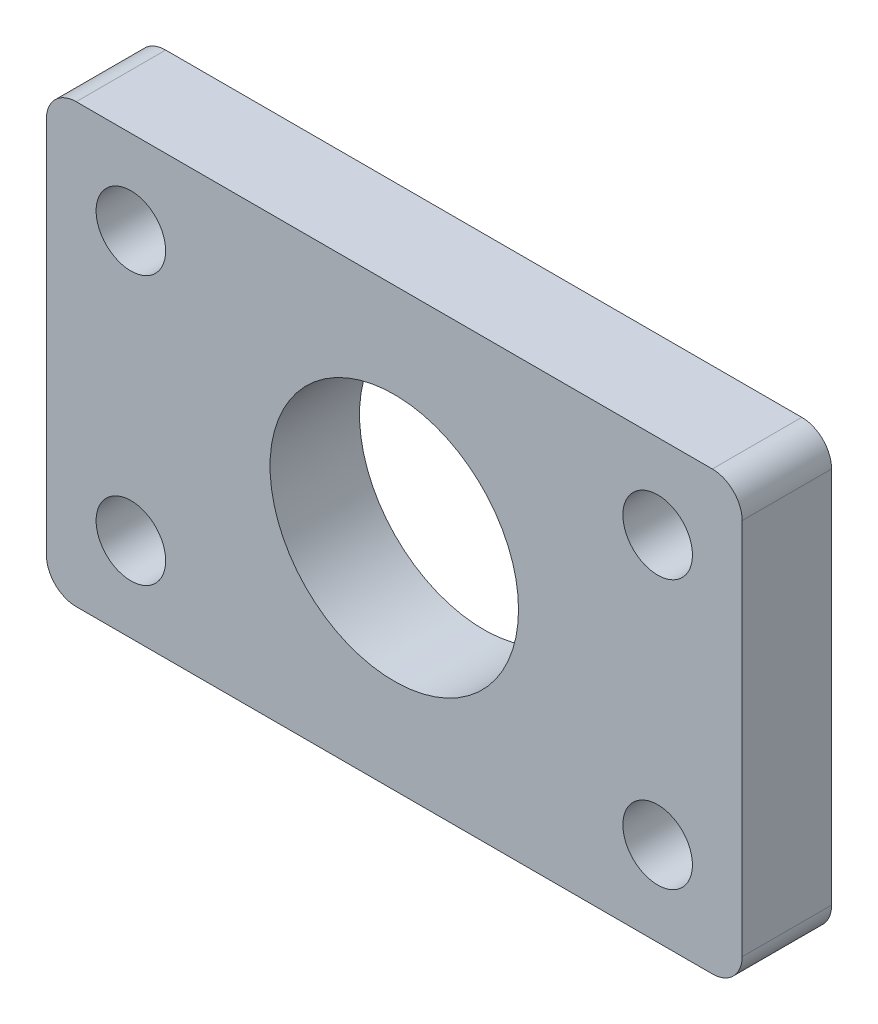
ISO-10303-21;
HEADER;
FILE_DESCRIPTION(('STEP AP214'),'2;1');
FILE_NAME('part.step','',(''),(''),'','','');
FILE_SCHEMA(('AUTOMOTIVE_DESIGN { 1 0 10303 214 1 1 1 1 }'));
ENDSEC;
DATA;
#1=APPLICATION_CONTEXT('core data for automotive mechanical design processes');
#2=APPLICATION_PROTOCOL_DEFINITION('international standard','automotive_design',2000,#1);
#3=PRODUCT_CONTEXT('',#1,'mechanical');
#4=PRODUCT('Part','Part','',(#3));
#5=PRODUCT_RELATED_PRODUCT_CATEGORY('part','',(#4));
#6=PRODUCT_DEFINITION_FORMATION('','',#4);
#7=PRODUCT_DEFINITION_CONTEXT('part definition',#1,'design');
#8=PRODUCT_DEFINITION('design','',#6,#7);
#9=PRODUCT_DEFINITION_SHAPE('','',#8);
#10=(LENGTH_UNIT() NAMED_UNIT(*) SI_UNIT(.MILLI.,.METRE.));
#11=(NAMED_UNIT(*) PLANE_ANGLE_UNIT() SI_UNIT($,.RADIAN.));
#12=(NAMED_UNIT(*) SI_UNIT($,.STERADIAN.) SOLID_ANGLE_UNIT());
#13=UNCERTAINTY_MEASURE_WITH_UNIT(LENGTH_MEASURE(1.E-05),#10,'distance_accuracy_value','');
#14=(GEOMETRIC_REPRESENTATION_CONTEXT(3) GLOBAL_UNCERTAINTY_ASSIGNED_CONTEXT((#13)) GLOBAL_UNIT_ASSIGNED_CONTEXT((#10,
#11,#12)) REPRESENTATION_CONTEXT('',''));
#15=CARTESIAN_POINT('',(0.,0.,0.));
#16=DIRECTION('',(0.,0.,1.));
#17=DIRECTION('',(1.,0.,0.));
#18=AXIS2_PLACEMENT_3D('',#15,#16,#17);
#19=CARTESIAN_POINT('',(-32.,-19.,9.));
#20=DIRECTION('',(0.,0.,-1.));
#21=DIRECTION('',(-1.,0.,0.));
#22=AXIS2_PLACEMENT_3D('',#19,#20,#21);
#23=CYLINDRICAL_SURFACE('',#22,3.);
#24=DIRECTION('',(0.,0.,-1.));
#25=VECTOR('',#24,1.);
#26=CARTESIAN_POINT('',(-35.,-19.,4.5));
#27=LINE('',#26,#25);
#28=CARTESIAN_POINT('',(-35.,-19.,9.));
#29=VERTEX_POINT('',#28);
#30=CARTESIAN_POINT('',(-35.,-19.,0.));
#31=VERTEX_POINT('',#30);
#32=EDGE_CURVE('E116',#29,#31,#27,.T.);
#33=ORIENTED_EDGE('',*,*,#32,.T.);
#34=CARTESIAN_POINT('',(-32.,-19.,0.));
#35=DIRECTION('',(0.,0.,-1.));
#36=DIRECTION('',(-1.,0.,0.));
#37=AXIS2_PLACEMENT_3D('',#34,#35,#36);
#38=CIRCLE('',#37,3.);
#39=CARTESIAN_POINT('',(-32.,-22.,0.));
#40=VERTEX_POINT('',#39);
#41=EDGE_CURVE('E95',#40,#31,#38,.T.);
#42=ORIENTED_EDGE('',*,*,#41,.F.);
#43=DIRECTION('',(0.,0.,1.));
#44=VECTOR('',#43,1.);
#45=CARTESIAN_POINT('',(-32.,-22.,4.5));
#46=LINE('',#45,#44);
#47=CARTESIAN_POINT('',(-32.,-22.,9.));
#48=VERTEX_POINT('',#47);
#49=EDGE_CURVE('E91',#40,#48,#46,.T.);
#50=ORIENTED_EDGE('',*,*,#49,.T.);
#51=CARTESIAN_POINT('',(-32.,-19.,9.));
#52=DIRECTION('',(0.,0.,-1.));
#53=DIRECTION('',(-1.,0.,0.));
#54=AXIS2_PLACEMENT_3D('',#51,#52,#53);
#55=CIRCLE('',#54,3.);
#56=EDGE_CURVE('E144',#48,#29,#55,.T.);
#57=ORIENTED_EDGE('',*,*,#56,.T.);
#58=EDGE_LOOP('',(#33,#42,#50,#57));
#59=FACE_BOUND('',#58,.T.);
#60=ADVANCED_FACE('F14',(#59),#23,.T.);
#61=CARTESIAN_POINT('',(-35.,-19.,9.));
#62=DIRECTION('',(1.,0.,0.));
#63=DIRECTION('',(0.,0.,-1.));
#64=AXIS2_PLACEMENT_3D('',#61,#62,#63);
#65=PLANE('',#64);
#66=ORIENTED_EDGE('',*,*,#32,.F.);
#67=DIRECTION('',(0.,1.,0.));
#68=VECTOR('',#67,1.);
#69=CARTESIAN_POINT('',(-35.,0.,9.));
#70=LINE('',#69,#68);
#71=CARTESIAN_POINT('',(-35.,19.,9.));
#72=VERTEX_POINT('',#71);
#73=EDGE_CURVE('E143',#29,#72,#70,.T.);
#74=ORIENTED_EDGE('',*,*,#73,.T.);
#75=DIRECTION('',(0.,0.,1.));
#76=VECTOR('',#75,1.);
#77=CARTESIAN_POINT('',(-35.,19.,4.5));
#78=LINE('',#77,#76);
#79=CARTESIAN_POINT('',(-35.,19.,0.));
#80=VERTEX_POINT('',#79);
#81=EDGE_CURVE('E113',#72,#80,#78,.F.);
#82=ORIENTED_EDGE('',*,*,#81,.T.);
#83=DIRECTION('',(0.,1.,0.));
#84=VECTOR('',#83,1.);
#85=CARTESIAN_POINT('',(-35.,0.,0.));
#86=LINE('',#85,#84);
#87=EDGE_CURVE('E97',#31,#80,#86,.T.);
#88=ORIENTED_EDGE('',*,*,#87,.F.);
#89=EDGE_LOOP('',(#66,#74,#82,#88));
#90=FACE_BOUND('',#89,.T.);
#91=ADVANCED_FACE('F167',(#90),#65,.F.);
#92=CARTESIAN_POINT('',(-32.,19.,9.));
#93=DIRECTION('',(0.,0.,-1.));
#94=DIRECTION('',(-1.,0.,0.));
#95=AXIS2_PLACEMENT_3D('',#92,#93,#94);
#96=CYLINDRICAL_SURFACE('',#95,3.);
#97=DIRECTION('',(0.,0.,-1.));
#98=VECTOR('',#97,1.);
#99=CARTESIAN_POINT('',(-32.,22.,4.5));
#100=LINE('',#99,#98);
#101=CARTESIAN_POINT('',(-32.,22.,9.));
#102=VERTEX_POINT('',#101);
#103=CARTESIAN_POINT('',(-32.,22.,0.));
#104=VERTEX_POINT('',#103);
#105=EDGE_CURVE('E110',#102,#104,#100,.T.);
#106=ORIENTED_EDGE('',*,*,#105,.T.);
#107=CARTESIAN_POINT('',(-32.,19.,0.));
#108=DIRECTION('',(0.,0.,-1.));
#109=DIRECTION('',(-1.,0.,0.));
#110=AXIS2_PLACEMENT_3D('',#107,#108,#109);
#111=CIRCLE('',#110,3.);
#112=EDGE_CURVE('E162',#80,#104,#111,.T.);
#113=ORIENTED_EDGE('',*,*,#112,.F.);
#114=ORIENTED_EDGE('',*,*,#81,.F.);
#115=CARTESIAN_POINT('',(-32.,19.,9.));
#116=DIRECTION('',(0.,0.,-1.));
#117=DIRECTION('',(-1.,0.,0.));
#118=AXIS2_PLACEMENT_3D('',#115,#116,#117);
#119=CIRCLE('',#118,3.);
#120=EDGE_CURVE('E140',#72,#102,#119,.T.);
#121=ORIENTED_EDGE('',*,*,#120,.T.);
#122=EDGE_LOOP('',(#106,#113,#114,#121));
#123=FACE_BOUND('',#122,.T.);
#124=ADVANCED_FACE('F171',(#123),#96,.T.);
#125=CARTESIAN_POINT('',(-32.,22.,9.));
#126=DIRECTION('',(0.,-1.,0.));
#127=DIRECTION('',(0.,0.,-1.));
#128=AXIS2_PLACEMENT_3D('',#125,#126,#127);
#129=PLANE('',#128);
#130=DIRECTION('',(0.,0.,1.));
#131=VECTOR('',#130,1.);
#132=CARTESIAN_POINT('',(32.0000000006153,22.,4.5));
#133=LINE('',#132,#131);
#134=CARTESIAN_POINT('',(32.0000000003077,22.,9.));
#135=VERTEX_POINT('',#134);
#136=CARTESIAN_POINT('',(32.0000000003077,22.,0.));
#137=VERTEX_POINT('',#136);
#138=EDGE_CURVE('E107',#135,#137,#133,.F.);
#139=ORIENTED_EDGE('',*,*,#138,.T.);
#140=DIRECTION('',(1.,0.,0.));
#141=VECTOR('',#140,1.);
#142=CARTESIAN_POINT('',(0.,22.,0.));
#143=LINE('',#142,#141);
#144=EDGE_CURVE('E161',#104,#137,#143,.T.);
#145=ORIENTED_EDGE('',*,*,#144,.F.);
#146=ORIENTED_EDGE('',*,*,#105,.F.);
#147=DIRECTION('',(1.,0.,0.));
#148=VECTOR('',#147,1.);
#149=CARTESIAN_POINT('',(0.,22.,9.));
#150=LINE('',#149,#148);
#151=EDGE_CURVE('E139',#102,#135,#150,.T.);
#152=ORIENTED_EDGE('',*,*,#151,.T.);
#153=EDGE_LOOP('',(#139,#145,#146,#152));
#154=FACE_BOUND('',#153,.T.);
#155=ADVANCED_FACE('F176',(#154),#129,.F.);
#156=CARTESIAN_POINT('',(32.,19.,9.));
#157=DIRECTION('',(0.,0.,-1.));
#158=DIRECTION('',(-1.,0.,0.));
#159=AXIS2_PLACEMENT_3D('',#156,#157,#158);
#160=CYLINDRICAL_SURFACE('',#159,3.);
#161=DIRECTION('',(0.,0.,-1.));
#162=VECTOR('',#161,1.);
#163=CARTESIAN_POINT('',(35.,19.,4.5));
#164=LINE('',#163,#162);
#165=CARTESIAN_POINT('',(35.,19.,9.));
#166=VERTEX_POINT('',#165);
#167=CARTESIAN_POINT('',(35.,19.,0.));
#168=VERTEX_POINT('',#167);
#169=EDGE_CURVE('E105',#166,#168,#164,.T.);
#170=ORIENTED_EDGE('',*,*,#169,.T.);
#171=CARTESIAN_POINT('',(32.,19.,0.));
#172=DIRECTION('',(0.,0.,-1.));
#173=DIRECTION('',(-1.,0.,0.));
#174=AXIS2_PLACEMENT_3D('',#171,#172,#173);
#175=CIRCLE('',#174,3.);
#176=EDGE_CURVE('E159',#137,#168,#175,.T.);
#177=ORIENTED_EDGE('',*,*,#176,.F.);
#178=ORIENTED_EDGE('',*,*,#138,.F.);
#179=CARTESIAN_POINT('',(32.,19.,9.));
#180=DIRECTION('',(0.,0.,-1.));
#181=DIRECTION('',(-1.,0.,0.));
#182=AXIS2_PLACEMENT_3D('',#179,#180,#181);
#183=CIRCLE('',#182,3.);
#184=EDGE_CURVE('E136',#135,#166,#183,.T.);
#185=ORIENTED_EDGE('',*,*,#184,.T.);
#186=EDGE_LOOP('',(#170,#177,#178,#185));
#187=FACE_BOUND('',#186,.T.);
#188=ADVANCED_FACE('F189',(#187),#160,.T.);
#189=CARTESIAN_POINT('',(35.,-19.,0.));
#190=DIRECTION('',(-1.,0.,0.));
#191=DIRECTION('',(0.,0.,1.));
#192=AXIS2_PLACEMENT_3D('',#189,#190,#191);
#193=PLANE('',#192);
#194=DIRECTION('',(0.,0.,1.));
#195=VECTOR('',#194,1.);
#196=CARTESIAN_POINT('',(35.,-19.0000000012306,4.5));
#197=LINE('',#196,#195);
#198=CARTESIAN_POINT('',(35.,-19.0000000006153,9.));
#199=VERTEX_POINT('',#198);
#200=CARTESIAN_POINT('',(35.,-19.0000000006153,0.));
#201=VERTEX_POINT('',#200);
#202=EDGE_CURVE('E103',#199,#201,#197,.F.);
#203=ORIENTED_EDGE('',*,*,#202,.T.);
#204=DIRECTION('',(0.,-1.,0.));
#205=VECTOR('',#204,1.);
#206=CARTESIAN_POINT('',(35.,0.,0.));
#207=LINE('',#206,#205);
#208=EDGE_CURVE('E79',#168,#201,#207,.T.);
#209=ORIENTED_EDGE('',*,*,#208,.F.);
#210=ORIENTED_EDGE('',*,*,#169,.F.);
#211=DIRECTION('',(0.,-1.,0.));
#212=VECTOR('',#211,1.);
#213=CARTESIAN_POINT('',(35.,0.,9.));
#214=LINE('',#213,#212);
#215=EDGE_CURVE('E135',#166,#199,#214,.T.);
#216=ORIENTED_EDGE('',*,*,#215,.T.);
#217=EDGE_LOOP('',(#203,#209,#210,#216));
#218=FACE_BOUND('',#217,.T.);
#219=ADVANCED_FACE('F180',(#218),#193,.F.);
#220=CARTESIAN_POINT('',(32.,-19.,9.));
#221=DIRECTION('',(0.,0.,-1.));
#222=DIRECTION('',(-1.,0.,0.));
#223=AXIS2_PLACEMENT_3D('',#220,#221,#222);
#224=CYLINDRICAL_SURFACE('',#223,3.);
#225=DIRECTION('',(0.,0.,-1.));
#226=VECTOR('',#225,1.);
#227=CARTESIAN_POINT('',(32.,-22.,4.5));
#228=LINE('',#227,#226);
#229=CARTESIAN_POINT('',(32.,-22.,9.));
#230=VERTEX_POINT('',#229);
#231=CARTESIAN_POINT('',(32.,-22.,0.));
#232=VERTEX_POINT('',#231);
#233=EDGE_CURVE('E33',#230,#232,#228,.T.);
#234=ORIENTED_EDGE('',*,*,#233,.T.);
#235=CARTESIAN_POINT('',(32.,-19.,0.));
#236=DIRECTION('',(0.,0.,-1.));
#237=DIRECTION('',(-1.,0.,0.));
#238=AXIS2_PLACEMENT_3D('',#235,#236,#237);
#239=CIRCLE('',#238,3.);
#240=EDGE_CURVE('E18',#201,#232,#239,.T.);
#241=ORIENTED_EDGE('',*,*,#240,.F.);
#242=ORIENTED_EDGE('',*,*,#202,.F.);
#243=CARTESIAN_POINT('',(32.,-19.,9.));
#244=DIRECTION('',(0.,0.,-1.));
#245=DIRECTION('',(-1.,0.,0.));
#246=AXIS2_PLACEMENT_3D('',#243,#244,#245);
#247=CIRCLE('',#246,3.);
#248=EDGE_CURVE('E90',#199,#230,#247,.T.);
#249=ORIENTED_EDGE('',*,*,#248,.T.);
#250=EDGE_LOOP('',(#234,#241,#242,#249));
#251=FACE_BOUND('',#250,.T.);
#252=ADVANCED_FACE('F88',(#251),#224,.T.);
#253=CARTESIAN_POINT('',(-32.,-22.,0.));
#254=DIRECTION('',(0.,1.,0.));
#255=DIRECTION('',(0.,0.,1.));
#256=AXIS2_PLACEMENT_3D('',#253,#254,#255);
#257=PLANE('',#256);
#258=ORIENTED_EDGE('',*,*,#233,.F.);
#259=DIRECTION('',(-1.,0.,0.));
#260=VECTOR('',#259,1.);
#261=CARTESIAN_POINT('',(0.,-22.,9.));
#262=LINE('',#261,#260);
#263=EDGE_CURVE('E133',#230,#48,#262,.T.);
#264=ORIENTED_EDGE('',*,*,#263,.T.);
#265=ORIENTED_EDGE('',*,*,#49,.F.);
#266=DIRECTION('',(-1.,0.,0.));
#267=VECTOR('',#266,1.);
#268=CARTESIAN_POINT('',(0.,-22.,0.));
#269=LINE('',#268,#267);
#270=EDGE_CURVE('E84',#232,#40,#269,.T.);
#271=ORIENTED_EDGE('',*,*,#270,.F.);
#272=EDGE_LOOP('',(#258,#264,#265,#271));
#273=FACE_BOUND('',#272,.T.);
#274=ADVANCED_FACE('F93',(#273),#257,.F.);
#275=CARTESIAN_POINT('',(-26.5,-13.5,0.));
#276=DIRECTION('',(0.,0.,1.));
#277=DIRECTION('',(1.,0.,0.));
#278=AXIS2_PLACEMENT_3D('',#275,#276,#277);
#279=CYLINDRICAL_SURFACE('',#278,3.5);
#280=CARTESIAN_POINT('',(-26.5,-13.5,0.));
#281=DIRECTION('',(0.,0.,1.));
#282=DIRECTION('',(1.,0.,0.));
#283=AXIS2_PLACEMENT_3D('',#280,#281,#282);
#284=CIRCLE('',#283,3.5);
#285=CARTESIAN_POINT('',(-23.,-13.5,0.));
#286=VERTEX_POINT('',#285);
#287=EDGE_CURVE('E156',#286,#286,#284,.T.);
#288=ORIENTED_EDGE('',*,*,#287,.F.);
#289=EDGE_LOOP('',(#288));
#290=FACE_BOUND('',#289,.T.);
#291=CARTESIAN_POINT('',(-26.5,-13.5,9.));
#292=DIRECTION('',(0.,0.,1.));
#293=DIRECTION('',(1.,0.,0.));
#294=AXIS2_PLACEMENT_3D('',#291,#292,#293);
#295=CIRCLE('',#294,3.5);
#296=CARTESIAN_POINT('',(-23.,-13.5,9.));
#297=VERTEX_POINT('',#296);
#298=EDGE_CURVE('E130',#297,#297,#295,.T.);
#299=ORIENTED_EDGE('',*,*,#298,.T.);
#300=EDGE_LOOP('',(#299));
#301=FACE_BOUND('',#300,.T.);
#302=ADVANCED_FACE('F222',(#290,#301),#279,.F.);
#303=CARTESIAN_POINT('',(26.5,-13.5,0.));
#304=DIRECTION('',(0.,0.,1.));
#305=DIRECTION('',(1.,0.,0.));
#306=AXIS2_PLACEMENT_3D('',#303,#304,#305);
#307=CYLINDRICAL_SURFACE('',#306,3.5);
#308=CARTESIAN_POINT('',(26.5,-13.5,0.));
#309=DIRECTION('',(0.,0.,1.));
#310=DIRECTION('',(1.,0.,0.));
#311=AXIS2_PLACEMENT_3D('',#308,#309,#310);
#312=CIRCLE('',#311,3.5);
#313=CARTESIAN_POINT('',(30.,-13.5,0.));
#314=VERTEX_POINT('',#313);
#315=EDGE_CURVE('E153',#314,#314,#312,.T.);
#316=ORIENTED_EDGE('',*,*,#315,.F.);
#317=EDGE_LOOP('',(#316));
#318=FACE_BOUND('',#317,.T.);
#319=CARTESIAN_POINT('',(26.5,-13.5,9.));
#320=DIRECTION('',(0.,0.,1.));
#321=DIRECTION('',(1.,0.,0.));
#322=AXIS2_PLACEMENT_3D('',#319,#320,#321);
#323=CIRCLE('',#322,3.5);
#324=CARTESIAN_POINT('',(30.,-13.5,9.));
#325=VERTEX_POINT('',#324);
#326=EDGE_CURVE('E127',#325,#325,#323,.T.);
#327=ORIENTED_EDGE('',*,*,#326,.T.);
#328=EDGE_LOOP('',(#327));
#329=FACE_BOUND('',#328,.T.);
#330=ADVANCED_FACE('F218',(#318,#329),#307,.F.);
#331=CARTESIAN_POINT('',(26.5,13.5,0.));
#332=DIRECTION('',(0.,0.,1.));
#333=DIRECTION('',(1.,0.,0.));
#334=AXIS2_PLACEMENT_3D('',#331,#332,#333);
#335=CYLINDRICAL_SURFACE('',#334,3.5);
#336=CARTESIAN_POINT('',(26.5,13.5,0.));
#337=DIRECTION('',(0.,0.,1.));
#338=DIRECTION('',(1.,0.,0.));
#339=AXIS2_PLACEMENT_3D('',#336,#337,#338);
#340=CIRCLE('',#339,3.5);
#341=CARTESIAN_POINT('',(30.,13.5,0.));
#342=VERTEX_POINT('',#341);
#343=EDGE_CURVE('E150',#342,#342,#340,.T.);
#344=ORIENTED_EDGE('',*,*,#343,.F.);
#345=EDGE_LOOP('',(#344));
#346=FACE_BOUND('',#345,.T.);
#347=CARTESIAN_POINT('',(26.5,13.5,9.));
#348=DIRECTION('',(0.,0.,1.));
#349=DIRECTION('',(1.,0.,0.));
#350=AXIS2_PLACEMENT_3D('',#347,#348,#349);
#351=CIRCLE('',#350,3.5);
#352=CARTESIAN_POINT('',(30.,13.5,9.));
#353=VERTEX_POINT('',#352);
#354=EDGE_CURVE('E124',#353,#353,#351,.T.);
#355=ORIENTED_EDGE('',*,*,#354,.T.);
#356=EDGE_LOOP('',(#355));
#357=FACE_BOUND('',#356,.T.);
#358=ADVANCED_FACE('F214',(#346,#357),#335,.F.);
#359=CARTESIAN_POINT('',(-26.5,13.5,0.));
#360=DIRECTION('',(0.,0.,1.));
#361=DIRECTION('',(1.,0.,0.));
#362=AXIS2_PLACEMENT_3D('',#359,#360,#361);
#363=CYLINDRICAL_SURFACE('',#362,3.5);
#364=CARTESIAN_POINT('',(-26.5,13.5,0.));
#365=DIRECTION('',(0.,0.,1.));
#366=DIRECTION('',(1.,0.,0.));
#367=AXIS2_PLACEMENT_3D('',#364,#365,#366);
#368=CIRCLE('',#367,3.5);
#369=CARTESIAN_POINT('',(-23.,13.5,0.));
#370=VERTEX_POINT('',#369);
#371=EDGE_CURVE('E147',#370,#370,#368,.T.);
#372=ORIENTED_EDGE('',*,*,#371,.F.);
#373=EDGE_LOOP('',(#372));
#374=FACE_BOUND('',#373,.T.);
#375=CARTESIAN_POINT('',(-26.5,13.5,9.));
#376=DIRECTION('',(0.,0.,1.));
#377=DIRECTION('',(1.,0.,0.));
#378=AXIS2_PLACEMENT_3D('',#375,#376,#377);
#379=CIRCLE('',#378,3.5);
#380=CARTESIAN_POINT('',(-23.,13.5,9.));
#381=VERTEX_POINT('',#380);
#382=EDGE_CURVE('E121',#381,#381,#379,.T.);
#383=ORIENTED_EDGE('',*,*,#382,.T.);
#384=EDGE_LOOP('',(#383));
#385=FACE_BOUND('',#384,.T.);
#386=ADVANCED_FACE('F211',(#374,#385),#363,.F.);
#387=CARTESIAN_POINT('',(35.,-22.,0.));
#388=DIRECTION('',(0.,0.,-1.));
#389=DIRECTION('',(-1.,0.,0.));
#390=AXIS2_PLACEMENT_3D('',#387,#388,#389);
#391=PLANE('',#390);
#392=ORIENTED_EDGE('',*,*,#371,.T.);
#393=EDGE_LOOP('',(#392));
#394=FACE_BOUND('',#393,.T.);
#395=ORIENTED_EDGE('',*,*,#343,.T.);
#396=EDGE_LOOP('',(#395));
#397=FACE_BOUND('',#396,.T.);
#398=ORIENTED_EDGE('',*,*,#315,.T.);
#399=EDGE_LOOP('',(#398));
#400=FACE_BOUND('',#399,.T.);
#401=ORIENTED_EDGE('',*,*,#287,.T.);
#402=EDGE_LOOP('',(#401));
#403=FACE_BOUND('',#402,.T.);
#404=CARTESIAN_POINT('',(0.,0.,0.));
#405=DIRECTION('',(0.,0.,1.));
#406=DIRECTION('',(1.,0.,0.));
#407=AXIS2_PLACEMENT_3D('',#404,#405,#406);
#408=CIRCLE('',#407,12.5);
#409=CARTESIAN_POINT('',(12.5,0.,0.));
#410=VERTEX_POINT('',#409);
#411=EDGE_CURVE('E24',#410,#410,#408,.F.);
#412=ORIENTED_EDGE('',*,*,#411,.F.);
#413=EDGE_LOOP('',(#412));
#414=FACE_BOUND('',#413,.T.);
#415=ORIENTED_EDGE('',*,*,#144,.T.);
#416=ORIENTED_EDGE('',*,*,#176,.T.);
#417=ORIENTED_EDGE('',*,*,#208,.T.);
#418=ORIENTED_EDGE('',*,*,#240,.T.);
#419=ORIENTED_EDGE('',*,*,#270,.T.);
#420=ORIENTED_EDGE('',*,*,#41,.T.);
#421=ORIENTED_EDGE('',*,*,#87,.T.);
#422=ORIENTED_EDGE('',*,*,#112,.T.);
#423=EDGE_LOOP('',(#415,#416,#417,#418,#419,#420,#421,#422));
#424=FACE_BOUND('',#423,.T.);
#425=ADVANCED_FACE('F83',(#394,#397,#400,#403,#414,#424),#391,.T.);
#426=CARTESIAN_POINT('',(35.,-22.,9.));
#427=DIRECTION('',(0.,0.,-1.));
#428=DIRECTION('',(-1.,0.,0.));
#429=AXIS2_PLACEMENT_3D('',#426,#427,#428);
#430=PLANE('',#429);
#431=ORIENTED_EDGE('',*,*,#382,.F.);
#432=EDGE_LOOP('',(#431));
#433=FACE_BOUND('',#432,.T.);
#434=ORIENTED_EDGE('',*,*,#354,.F.);
#435=EDGE_LOOP('',(#434));
#436=FACE_BOUND('',#435,.T.);
#437=ORIENTED_EDGE('',*,*,#326,.F.);
#438=EDGE_LOOP('',(#437));
#439=FACE_BOUND('',#438,.T.);
#440=ORIENTED_EDGE('',*,*,#298,.F.);
#441=EDGE_LOOP('',(#440));
#442=FACE_BOUND('',#441,.T.);
#443=CARTESIAN_POINT('',(0.,0.,9.));
#444=DIRECTION('',(0.,0.,1.));
#445=DIRECTION('',(1.,0.,0.));
#446=AXIS2_PLACEMENT_3D('',#443,#444,#445);
#447=CIRCLE('',#446,12.5);
#448=CARTESIAN_POINT('',(12.5,0.,9.));
#449=VERTEX_POINT('',#448);
#450=EDGE_CURVE('E9',#449,#449,#447,.T.);
#451=ORIENTED_EDGE('',*,*,#450,.F.);
#452=EDGE_LOOP('',(#451));
#453=FACE_BOUND('',#452,.T.);
#454=ORIENTED_EDGE('',*,*,#248,.F.);
#455=ORIENTED_EDGE('',*,*,#215,.F.);
#456=ORIENTED_EDGE('',*,*,#184,.F.);
#457=ORIENTED_EDGE('',*,*,#151,.F.);
#458=ORIENTED_EDGE('',*,*,#120,.F.);
#459=ORIENTED_EDGE('',*,*,#73,.F.);
#460=ORIENTED_EDGE('',*,*,#56,.F.);
#461=ORIENTED_EDGE('',*,*,#263,.F.);
#462=EDGE_LOOP('',(#454,#455,#456,#457,#458,#459,#460,#461));
#463=FACE_BOUND('',#462,.T.);
#464=ADVANCED_FACE('F16',(#433,#436,#439,#442,#453,#463),#430,.F.);
#465=CARTESIAN_POINT('',(0.,0.,0.));
#466=DIRECTION('',(0.,0.,1.));
#467=DIRECTION('',(1.,0.,0.));
#468=AXIS2_PLACEMENT_3D('',#465,#466,#467);
#469=CYLINDRICAL_SURFACE('',#468,12.5);
#470=ORIENTED_EDGE('',*,*,#450,.T.);
#471=EDGE_LOOP('',(#470));
#472=FACE_BOUND('',#471,.T.);
#473=ORIENTED_EDGE('',*,*,#411,.T.);
#474=EDGE_LOOP('',(#473));
#475=FACE_BOUND('',#474,.T.);
#476=ADVANCED_FACE('F201',(#472,#475),#469,.F.);
#477=CLOSED_SHELL('',(#60,#91,#124,#155,#188,#219,#252,#274,#302,#330,#358,#386,#425,#464,#476));
#478=MANIFOLD_SOLID_BREP('B1',#477);
#479=ADVANCED_BREP_SHAPE_REPRESENTATION('',(#18,#478),#14);
#480=SHAPE_DEFINITION_REPRESENTATION(#9,#479);
ENDSEC;
END-ISO-10303-21;
